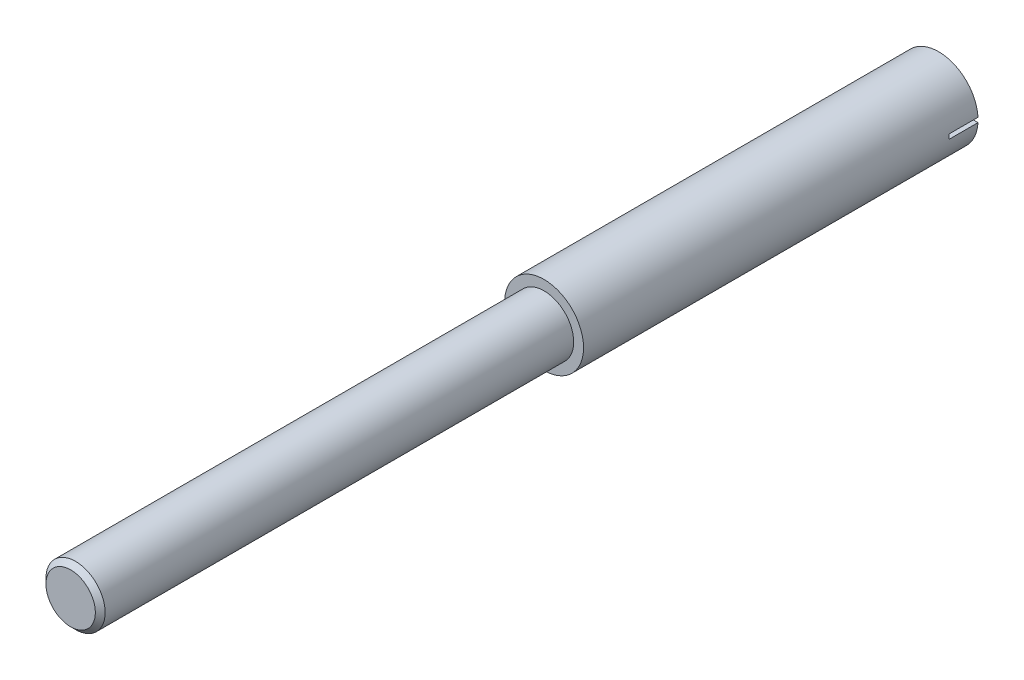
ISO-10303-21;
HEADER;
FILE_DESCRIPTION(('STEP AP214'),'2;1');
FILE_NAME('part.step','',(''),(''),'','','');
FILE_SCHEMA(('AUTOMOTIVE_DESIGN { 1 0 10303 214 1 1 1 1 }'));
ENDSEC;
DATA;
#1=APPLICATION_CONTEXT('core data for automotive mechanical design processes');
#2=APPLICATION_PROTOCOL_DEFINITION('international standard','automotive_design',2000,#1);
#3=PRODUCT_CONTEXT('',#1,'mechanical');
#4=PRODUCT('Part','Part','',(#3));
#5=PRODUCT_RELATED_PRODUCT_CATEGORY('part','',(#4));
#6=PRODUCT_DEFINITION_FORMATION('','',#4);
#7=PRODUCT_DEFINITION_CONTEXT('part definition',#1,'design');
#8=PRODUCT_DEFINITION('design','',#6,#7);
#9=PRODUCT_DEFINITION_SHAPE('','',#8);
#10=(LENGTH_UNIT() NAMED_UNIT(*) SI_UNIT(.MILLI.,.METRE.));
#11=(NAMED_UNIT(*) PLANE_ANGLE_UNIT() SI_UNIT($,.RADIAN.));
#12=(NAMED_UNIT(*) SI_UNIT($,.STERADIAN.) SOLID_ANGLE_UNIT());
#13=UNCERTAINTY_MEASURE_WITH_UNIT(LENGTH_MEASURE(1.E-05),#10,'distance_accuracy_value','');
#14=(GEOMETRIC_REPRESENTATION_CONTEXT(3) GLOBAL_UNCERTAINTY_ASSIGNED_CONTEXT((#13)) GLOBAL_UNIT_ASSIGNED_CONTEXT((#10,
#11,#12)) REPRESENTATION_CONTEXT('',''));
#15=CARTESIAN_POINT('',(0.,0.,0.));
#16=DIRECTION('',(0.,0.,1.));
#17=DIRECTION('',(1.,0.,0.));
#18=AXIS2_PLACEMENT_3D('',#15,#16,#17);
#19=CARTESIAN_POINT('',(0.,0.,0.));
#20=DIRECTION('',(0.,0.,1.));
#21=DIRECTION('',(1.,0.,0.));
#22=AXIS2_PLACEMENT_3D('',#19,#20,#21);
#23=PLANE('',#22);
#24=CARTESIAN_POINT('',(0.,0.,0.));
#25=DIRECTION('',(0.,0.,1.));
#26=DIRECTION('',(1.,0.,0.));
#27=AXIS2_PLACEMENT_3D('',#24,#25,#26);
#28=CIRCLE('',#27,0.5);
#29=CARTESIAN_POINT('',(0.49914106520602,0.029295,0.));
#30=VERTEX_POINT('',#29);
#31=CARTESIAN_POINT('',(-0.49914106520602,0.029295,0.));
#32=VERTEX_POINT('',#31);
#33=EDGE_CURVE('E92',#30,#32,#28,.T.);
#34=ORIENTED_EDGE('',*,*,#33,.F.);
#35=DIRECTION('',(-1.,0.,0.));
#36=VECTOR('',#35,1.);
#37=CARTESIAN_POINT('',(0.,0.029295,0.));
#38=LINE('',#37,#36);
#39=EDGE_CURVE('E112',#30,#32,#38,.T.);
#40=ORIENTED_EDGE('',*,*,#39,.T.);
#41=EDGE_LOOP('',(#34,#40));
#42=FACE_BOUND('',#41,.T.);
#43=ADVANCED_FACE('F33',(#42),#23,.F.);
#44=CARTESIAN_POINT('',(0.,0.,5.));
#45=DIRECTION('',(0.,0.,-1.));
#46=DIRECTION('',(-1.,0.,0.));
#47=AXIS2_PLACEMENT_3D('',#44,#45,#46);
#48=CYLINDRICAL_SURFACE('',#47,0.5);
#49=CARTESIAN_POINT('',(0.,0.,5.));
#50=DIRECTION('',(0.,0.,1.));
#51=DIRECTION('',(1.,0.,0.));
#52=AXIS2_PLACEMENT_3D('',#49,#50,#51);
#53=CIRCLE('',#52,0.5);
#54=CARTESIAN_POINT('',(0.5,0.,5.));
#55=VERTEX_POINT('',#54);
#56=EDGE_CURVE('E102',#55,#55,#53,.T.);
#57=ORIENTED_EDGE('',*,*,#56,.F.);
#58=EDGE_LOOP('',(#57));
#59=FACE_BOUND('',#58,.T.);
#60=CARTESIAN_POINT('',(0.,0.,0.37));
#61=DIRECTION('',(0.,0.,1.));
#62=DIRECTION('',(1.,0.,0.));
#63=AXIS2_PLACEMENT_3D('',#60,#61,#62);
#64=CIRCLE('',#63,0.5);
#65=CARTESIAN_POINT('',(0.49914106520602,-0.0292950000000001,0.369999999999999));
#66=VERTEX_POINT('',#65);
#67=CARTESIAN_POINT('',(0.49914106520602,0.0292949999999999,0.369999999999999));
#68=VERTEX_POINT('',#67);
#69=EDGE_CURVE('E37',#66,#68,#64,.T.);
#70=ORIENTED_EDGE('',*,*,#69,.T.);
#71=DIRECTION('',(0.,0.,-1.));
#72=VECTOR('',#71,1.);
#73=CARTESIAN_POINT('',(0.49914106520602,0.0292949999999996,5.));
#74=LINE('',#73,#72);
#75=EDGE_CURVE('E93',#68,#30,#74,.T.);
#76=ORIENTED_EDGE('',*,*,#75,.T.);
#77=ORIENTED_EDGE('',*,*,#33,.T.);
#78=DIRECTION('',(0.,0.,-1.));
#79=VECTOR('',#78,1.);
#80=CARTESIAN_POINT('',(-0.49914106520602,0.0292949999999996,5.));
#81=LINE('',#80,#79);
#82=CARTESIAN_POINT('',(-0.49914106520602,0.0292949999999999,0.369999999999999));
#83=VERTEX_POINT('',#82);
#84=EDGE_CURVE('E56',#32,#83,#81,.F.);
#85=ORIENTED_EDGE('',*,*,#84,.T.);
#86=CARTESIAN_POINT('',(-0.49914106520602,-0.0292950000000001,0.369999999999999));
#87=VERTEX_POINT('',#86);
#88=EDGE_CURVE('E11',#83,#87,#64,.T.);
#89=ORIENTED_EDGE('',*,*,#88,.T.);
#90=DIRECTION('',(0.,0.,-1.));
#91=VECTOR('',#90,1.);
#92=CARTESIAN_POINT('',(-0.49914106520602,-0.0292950000000005,5.));
#93=LINE('',#92,#91);
#94=CARTESIAN_POINT('',(-0.49914106520602,-0.0292950000000001,0.));
#95=VERTEX_POINT('',#94);
#96=EDGE_CURVE('E74',#87,#95,#93,.T.);
#97=ORIENTED_EDGE('',*,*,#96,.T.);
#98=CARTESIAN_POINT('',(0.49914106520602,-0.0292950000000001,0.));
#99=VERTEX_POINT('',#98);
#100=EDGE_CURVE('E101',#95,#99,#28,.T.);
#101=ORIENTED_EDGE('',*,*,#100,.T.);
#102=DIRECTION('',(0.,0.,-1.));
#103=VECTOR('',#102,1.);
#104=CARTESIAN_POINT('',(0.49914106520602,-0.0292950000000005,5.));
#105=LINE('',#104,#103);
#106=EDGE_CURVE('E48',#99,#66,#105,.F.);
#107=ORIENTED_EDGE('',*,*,#106,.T.);
#108=EDGE_LOOP('',(#70,#76,#77,#85,#89,#97,#101,#107));
#109=FACE_BOUND('',#108,.T.);
#110=ADVANCED_FACE('F88',(#59,#109),#48,.T.);
#111=CARTESIAN_POINT('',(0.,0.,5.));
#112=DIRECTION('',(0.,0.,1.));
#113=DIRECTION('',(1.,0.,0.));
#114=AXIS2_PLACEMENT_3D('',#111,#112,#113);
#115=PLANE('',#114);
#116=CARTESIAN_POINT('',(0.,0.,5.));
#117=DIRECTION('',(0.,0.,1.));
#118=DIRECTION('',(1.,0.,0.));
#119=AXIS2_PLACEMENT_3D('',#116,#117,#118);
#120=CIRCLE('',#119,0.375);
#121=CARTESIAN_POINT('',(0.375,0.,5.));
#122=VERTEX_POINT('',#121);
#123=EDGE_CURVE('E95',#122,#122,#120,.F.);
#124=ORIENTED_EDGE('',*,*,#123,.T.);
#125=EDGE_LOOP('',(#124));
#126=FACE_BOUND('',#125,.T.);
#127=ORIENTED_EDGE('',*,*,#56,.T.);
#128=EDGE_LOOP('',(#127));
#129=FACE_BOUND('',#128,.T.);
#130=ADVANCED_FACE('F131',(#126,#129),#115,.T.);
#131=ORIENTED_EDGE('',*,*,#100,.F.);
#132=DIRECTION('',(1.,0.,0.));
#133=VECTOR('',#132,1.);
#134=CARTESIAN_POINT('',(0.,-0.0292950000000001,0.));
#135=LINE('',#134,#133);
#136=EDGE_CURVE('E78',#95,#99,#135,.T.);
#137=ORIENTED_EDGE('',*,*,#136,.T.);
#138=EDGE_LOOP('',(#131,#137));
#139=FACE_BOUND('',#138,.T.);
#140=ADVANCED_FACE('F127',(#139),#23,.F.);
#141=CARTESIAN_POINT('',(0.,0.,11.));
#142=DIRECTION('',(0.,0.,-1.));
#143=DIRECTION('',(-1.,0.,0.));
#144=AXIS2_PLACEMENT_3D('',#141,#142,#143);
#145=CYLINDRICAL_SURFACE('',#144,0.375);
#146=CARTESIAN_POINT('',(0.,0.,10.938));
#147=DIRECTION('',(0.,0.,1.));
#148=DIRECTION('',(1.,0.,0.));
#149=AXIS2_PLACEMENT_3D('',#146,#147,#148);
#150=CIRCLE('',#149,0.375);
#151=CARTESIAN_POINT('',(0.375,0.,10.938));
#152=VERTEX_POINT('',#151);
#153=EDGE_CURVE('E109',#152,#152,#150,.F.);
#154=ORIENTED_EDGE('',*,*,#153,.T.);
#155=EDGE_LOOP('',(#154));
#156=FACE_BOUND('',#155,.T.);
#157=ORIENTED_EDGE('',*,*,#123,.F.);
#158=EDGE_LOOP('',(#157));
#159=FACE_BOUND('',#158,.T.);
#160=ADVANCED_FACE('F135',(#156,#159),#145,.T.);
#161=CARTESIAN_POINT('',(0.,0.,11.));
#162=DIRECTION('',(0.,0.,1.));
#163=DIRECTION('',(1.,0.,0.));
#164=AXIS2_PLACEMENT_3D('',#161,#162,#163);
#165=PLANE('',#164);
#166=CARTESIAN_POINT('',(0.,0.,11.));
#167=DIRECTION('',(0.,0.,1.));
#168=DIRECTION('',(1.,0.,0.));
#169=AXIS2_PLACEMENT_3D('',#166,#167,#168);
#170=CIRCLE('',#169,0.313000000000002);
#171=CARTESIAN_POINT('',(0.313000000000002,0.,11.));
#172=VERTEX_POINT('',#171);
#173=EDGE_CURVE('E105',#172,#172,#170,.T.);
#174=ORIENTED_EDGE('',*,*,#173,.T.);
#175=EDGE_LOOP('',(#174));
#176=FACE_BOUND('',#175,.T.);
#177=ADVANCED_FACE('F141',(#176),#165,.T.);
#178=CARTESIAN_POINT('',(0.,0.,11.));
#179=DIRECTION('',(0.,0.,-1.));
#180=DIRECTION('',(-1.,0.,0.));
#181=AXIS2_PLACEMENT_3D('',#178,#179,#180);
#182=CONICAL_SURFACE('',#181,0.313000000000002,0.785398163397432);
#183=ORIENTED_EDGE('',*,*,#153,.F.);
#184=EDGE_LOOP('',(#183));
#185=FACE_BOUND('',#184,.T.);
#186=ORIENTED_EDGE('',*,*,#173,.F.);
#187=EDGE_LOOP('',(#186));
#188=FACE_BOUND('',#187,.T.);
#189=ADVANCED_FACE('F35',(#185,#188),#182,.T.);
#190=CARTESIAN_POINT('',(-0.5,0.0292949999999999,0.369999999999999));
#191=DIRECTION('',(0.,0.,1.));
#192=DIRECTION('',(1.,0.,0.));
#193=AXIS2_PLACEMENT_3D('',#190,#191,#192);
#194=PLANE('',#193);
#195=DIRECTION('',(1.,0.,0.));
#196=VECTOR('',#195,1.);
#197=CARTESIAN_POINT('',(-0.5,0.0292949999999999,0.369999999999999));
#198=LINE('',#197,#196);
#199=EDGE_CURVE('E86',#83,#68,#198,.T.);
#200=ORIENTED_EDGE('',*,*,#199,.T.);
#201=ORIENTED_EDGE('',*,*,#69,.F.);
#202=DIRECTION('',(1.,0.,0.));
#203=VECTOR('',#202,1.);
#204=CARTESIAN_POINT('',(-0.5,-0.0292950000000001,0.369999999999999));
#205=LINE('',#204,#203);
#206=EDGE_CURVE('E77',#87,#66,#205,.T.);
#207=ORIENTED_EDGE('',*,*,#206,.F.);
#208=ORIENTED_EDGE('',*,*,#88,.F.);
#209=EDGE_LOOP('',(#200,#201,#207,#208));
#210=FACE_BOUND('',#209,.T.);
#211=ADVANCED_FACE('F85',(#210),#194,.F.);
#212=CARTESIAN_POINT('',(-0.5,0.029295,-0.370000000000001));
#213=DIRECTION('',(0.,1.,0.));
#214=DIRECTION('',(0.,0.,1.));
#215=AXIS2_PLACEMENT_3D('',#212,#213,#214);
#216=PLANE('',#215);
#217=ORIENTED_EDGE('',*,*,#199,.F.);
#218=ORIENTED_EDGE('',*,*,#84,.F.);
#219=ORIENTED_EDGE('',*,*,#39,.F.);
#220=ORIENTED_EDGE('',*,*,#75,.F.);
#221=EDGE_LOOP('',(#217,#218,#219,#220));
#222=FACE_BOUND('',#221,.T.);
#223=ADVANCED_FACE('F115',(#222),#216,.F.);
#224=CARTESIAN_POINT('',(-0.5,-0.029295,-0.370000000000001));
#225=DIRECTION('',(0.,-1.,0.));
#226=DIRECTION('',(0.,0.,-1.));
#227=AXIS2_PLACEMENT_3D('',#224,#225,#226);
#228=PLANE('',#227);
#229=ORIENTED_EDGE('',*,*,#206,.T.);
#230=ORIENTED_EDGE('',*,*,#106,.F.);
#231=ORIENTED_EDGE('',*,*,#136,.F.);
#232=ORIENTED_EDGE('',*,*,#96,.F.);
#233=EDGE_LOOP('',(#229,#230,#231,#232));
#234=FACE_BOUND('',#233,.T.);
#235=ADVANCED_FACE('F76',(#234),#228,.F.);
#236=CLOSED_SHELL('',(#43,#110,#130,#140,#160,#177,#189,#211,#223,#235));
#237=MANIFOLD_SOLID_BREP('B2',#236);
#238=ADVANCED_BREP_SHAPE_REPRESENTATION('',(#18,#237),#14);
#239=SHAPE_DEFINITION_REPRESENTATION(#9,#238);
ENDSEC;
END-ISO-10303-21;
